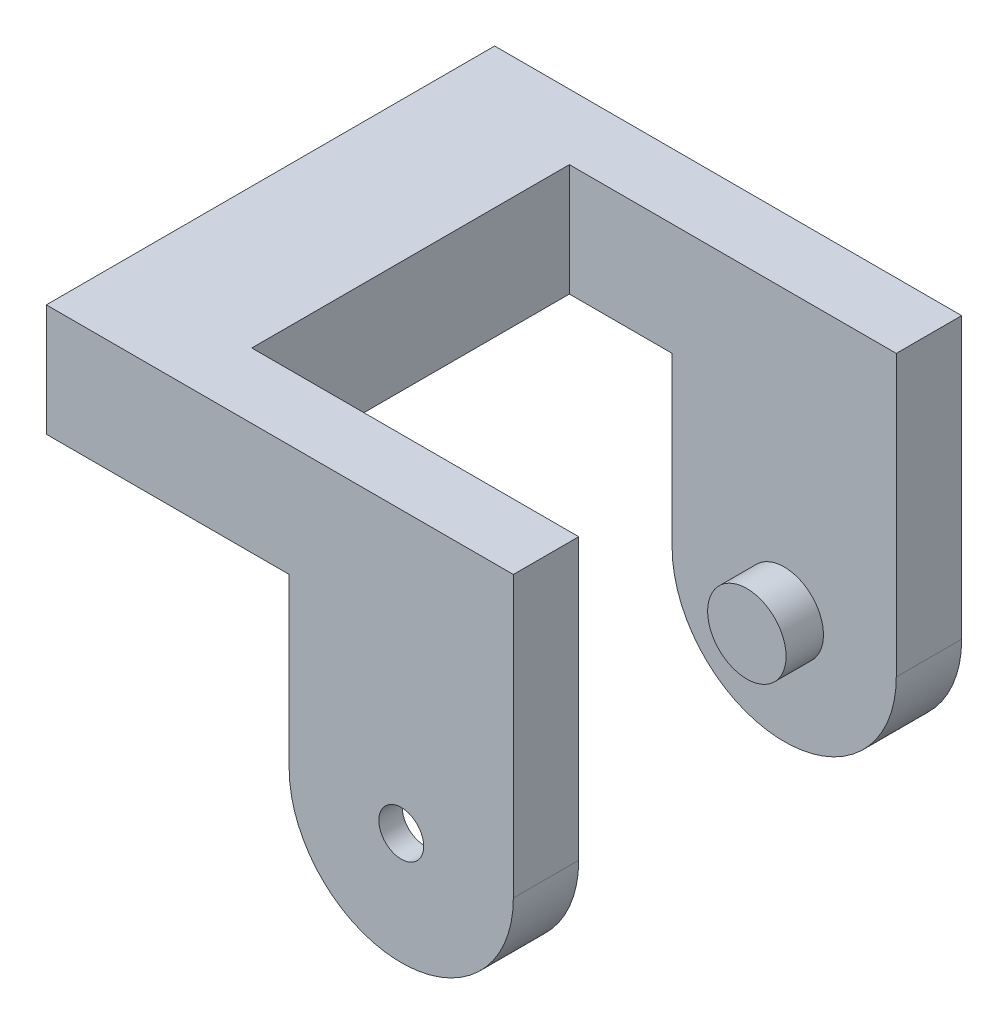
ISO-10303-21;
HEADER;
FILE_DESCRIPTION(('STEP AP214'),'2;1');
FILE_NAME('part.step','',(''),(''),'','','');
FILE_SCHEMA(('AUTOMOTIVE_DESIGN { 1 0 10303 214 1 1 1 1 }'));
ENDSEC;
DATA;
#1=APPLICATION_CONTEXT('core data for automotive mechanical design processes');
#2=APPLICATION_PROTOCOL_DEFINITION('international standard','automotive_design',2000,#1);
#3=PRODUCT_CONTEXT('',#1,'mechanical');
#4=PRODUCT('Part','Part','',(#3));
#5=PRODUCT_RELATED_PRODUCT_CATEGORY('part','',(#4));
#6=PRODUCT_DEFINITION_FORMATION('','',#4);
#7=PRODUCT_DEFINITION_CONTEXT('part definition',#1,'design');
#8=PRODUCT_DEFINITION('design','',#6,#7);
#9=PRODUCT_DEFINITION_SHAPE('','',#8);
#10=(LENGTH_UNIT() NAMED_UNIT(*) SI_UNIT(.MILLI.,.METRE.));
#11=(NAMED_UNIT(*) PLANE_ANGLE_UNIT() SI_UNIT($,.RADIAN.));
#12=(NAMED_UNIT(*) SI_UNIT($,.STERADIAN.) SOLID_ANGLE_UNIT());
#13=UNCERTAINTY_MEASURE_WITH_UNIT(LENGTH_MEASURE(1.E-05),#10,'distance_accuracy_value','');
#14=(GEOMETRIC_REPRESENTATION_CONTEXT(3) GLOBAL_UNCERTAINTY_ASSIGNED_CONTEXT((#13)) GLOBAL_UNIT_ASSIGNED_CONTEXT((#10,
#11,#12)) REPRESENTATION_CONTEXT('',''));
#15=CARTESIAN_POINT('',(0.,0.,0.));
#16=DIRECTION('',(0.,0.,1.));
#17=DIRECTION('',(1.,0.,0.));
#18=AXIS2_PLACEMENT_3D('',#15,#16,#17);
#19=CARTESIAN_POINT('',(12.,0.,-48.));
#20=DIRECTION('',(1.,0.,0.));
#21=DIRECTION('',(0.,0.,-1.));
#22=AXIS2_PLACEMENT_3D('',#19,#20,#21);
#23=PLANE('',#22);
#24=DIRECTION('',(0.,1.,0.));
#25=VECTOR('',#24,1.);
#26=CARTESIAN_POINT('',(12.,-12.,-7.));
#27=LINE('',#26,#25);
#28=CARTESIAN_POINT('',(12.,0.,-7.));
#29=VERTEX_POINT('',#28);
#30=CARTESIAN_POINT('',(12.,30.,-7.));
#31=VERTEX_POINT('',#30);
#32=EDGE_CURVE('E169',#29,#31,#27,.T.);
#33=ORIENTED_EDGE('',*,*,#32,.T.);
#34=DIRECTION('',(0.,0.,1.));
#35=VECTOR('',#34,1.);
#36=CARTESIAN_POINT('',(12.,30.,-48.));
#37=LINE('',#36,#35);
#38=CARTESIAN_POINT('',(12.,30.,0.));
#39=VERTEX_POINT('',#38);
#40=EDGE_CURVE('E251',#31,#39,#37,.T.);
#41=ORIENTED_EDGE('',*,*,#40,.T.);
#42=DIRECTION('',(0.,1.,0.));
#43=VECTOR('',#42,1.);
#44=CARTESIAN_POINT('',(12.,0.,0.));
#45=LINE('',#44,#43);
#46=CARTESIAN_POINT('',(12.,0.,0.));
#47=VERTEX_POINT('',#46);
#48=EDGE_CURVE('E196',#47,#39,#45,.T.);
#49=ORIENTED_EDGE('',*,*,#48,.F.);
#50=DIRECTION('',(0.,0.,1.));
#51=VECTOR('',#50,1.);
#52=CARTESIAN_POINT('',(12.,0.,-48.));
#53=LINE('',#52,#51);
#54=EDGE_CURVE('E160',#29,#47,#53,.T.);
#55=ORIENTED_EDGE('',*,*,#54,.F.);
#56=EDGE_LOOP('',(#33,#41,#49,#55));
#57=FACE_BOUND('',#56,.T.);
#58=ADVANCED_FACE('F47',(#57),#23,.T.);
#59=CARTESIAN_POINT('',(0.,0.,-48.));
#60=DIRECTION('',(0.,0.,1.));
#61=DIRECTION('',(1.,0.,0.));
#62=AXIS2_PLACEMENT_3D('',#59,#60,#61);
#63=CYLINDRICAL_SURFACE('',#62,2.4);
#64=CARTESIAN_POINT('',(0.,0.,0.));
#65=DIRECTION('',(0.,0.,1.));
#66=DIRECTION('',(1.,0.,0.));
#67=AXIS2_PLACEMENT_3D('',#64,#65,#66);
#68=CIRCLE('',#67,2.4);
#69=CARTESIAN_POINT('',(2.4,0.,0.));
#70=VERTEX_POINT('',#69);
#71=EDGE_CURVE('E174',#70,#70,#68,.T.);
#72=ORIENTED_EDGE('',*,*,#71,.T.);
#73=EDGE_LOOP('',(#72));
#74=FACE_BOUND('',#73,.T.);
#75=CARTESIAN_POINT('',(0.,0.,-2.5));
#76=DIRECTION('',(0.,0.,-1.));
#77=DIRECTION('',(0.,1.,0.));
#78=AXIS2_PLACEMENT_3D('',#75,#76,#77);
#79=CIRCLE('',#78,2.4);
#80=CARTESIAN_POINT('',(0.,2.4,-2.5));
#81=VERTEX_POINT('',#80);
#82=EDGE_CURVE('E206',#81,#81,#79,.F.);
#83=ORIENTED_EDGE('',*,*,#82,.F.);
#84=EDGE_LOOP('',(#83));
#85=FACE_BOUND('',#84,.T.);
#86=ADVANCED_FACE('F49',(#74,#85),#63,.F.);
#87=CARTESIAN_POINT('',(-12.,0.,-48.));
#88=DIRECTION('',(1.,0.,0.));
#89=DIRECTION('',(0.,0.,-1.));
#90=AXIS2_PLACEMENT_3D('',#87,#88,#89);
#91=PLANE('',#90);
#92=DIRECTION('',(0.,1.,0.));
#93=VECTOR('',#92,1.);
#94=CARTESIAN_POINT('',(-12.,0.,0.));
#95=LINE('',#94,#93);
#96=CARTESIAN_POINT('',(-12.,0.,0.));
#97=VERTEX_POINT('',#96);
#98=CARTESIAN_POINT('',(-12.,18.,0.));
#99=VERTEX_POINT('',#98);
#100=EDGE_CURVE('E171',#97,#99,#95,.T.);
#101=ORIENTED_EDGE('',*,*,#100,.T.);
#102=DIRECTION('',(0.,0.,-1.));
#103=VECTOR('',#102,1.);
#104=CARTESIAN_POINT('',(-12.,18.,0.));
#105=LINE('',#104,#103);
#106=CARTESIAN_POINT('',(-12.,18.,-6.99999999999999));
#107=VERTEX_POINT('',#106);
#108=EDGE_CURVE('E155',#99,#107,#105,.T.);
#109=ORIENTED_EDGE('',*,*,#108,.T.);
#110=DIRECTION('',(0.,1.,0.));
#111=VECTOR('',#110,1.);
#112=CARTESIAN_POINT('',(-12.,-12.,-7.));
#113=LINE('',#112,#111);
#114=CARTESIAN_POINT('',(-12.,0.,-7.));
#115=VERTEX_POINT('',#114);
#116=EDGE_CURVE('E141',#115,#107,#113,.T.);
#117=ORIENTED_EDGE('',*,*,#116,.F.);
#118=DIRECTION('',(0.,0.,1.));
#119=VECTOR('',#118,1.);
#120=CARTESIAN_POINT('',(-12.,0.,-48.));
#121=LINE('',#120,#119);
#122=EDGE_CURVE('E150',#115,#97,#121,.T.);
#123=ORIENTED_EDGE('',*,*,#122,.T.);
#124=EDGE_LOOP('',(#101,#109,#117,#123));
#125=FACE_BOUND('',#124,.T.);
#126=ADVANCED_FACE('F319',(#125),#91,.F.);
#127=CARTESIAN_POINT('',(0.,0.,-48.));
#128=DIRECTION('',(0.,0.,1.));
#129=DIRECTION('',(1.,0.,0.));
#130=AXIS2_PLACEMENT_3D('',#127,#128,#129);
#131=CYLINDRICAL_SURFACE('',#130,12.);
#132=CARTESIAN_POINT('',(0.,0.,-7.));
#133=DIRECTION('',(0.,0.,1.));
#134=DIRECTION('',(0.,-1.,0.));
#135=AXIS2_PLACEMENT_3D('',#132,#133,#134);
#136=CIRCLE('',#135,12.);
#137=EDGE_CURVE('E273',#29,#115,#136,.F.);
#138=ORIENTED_EDGE('',*,*,#137,.F.);
#139=ORIENTED_EDGE('',*,*,#54,.T.);
#140=CARTESIAN_POINT('',(0.,0.,0.));
#141=DIRECTION('',(0.,0.,1.));
#142=DIRECTION('',(1.,0.,0.));
#143=AXIS2_PLACEMENT_3D('',#140,#141,#142);
#144=CIRCLE('',#143,12.);
#145=EDGE_CURVE('E195',#97,#47,#144,.T.);
#146=ORIENTED_EDGE('',*,*,#145,.F.);
#147=ORIENTED_EDGE('',*,*,#122,.F.);
#148=EDGE_LOOP('',(#138,#139,#146,#147));
#149=FACE_BOUND('',#148,.T.);
#150=ADVANCED_FACE('F321',(#149),#131,.T.);
#151=CARTESIAN_POINT('',(12.,30.,-48.));
#152=VERTEX_POINT('',#151);
#153=CARTESIAN_POINT('',(12.,30.,-41.));
#154=VERTEX_POINT('',#153);
#155=EDGE_CURVE('E247',#152,#154,#37,.T.);
#156=ORIENTED_EDGE('',*,*,#155,.T.);
#157=DIRECTION('',(0.,-1.,0.));
#158=VECTOR('',#157,1.);
#159=CARTESIAN_POINT('',(12.,-12.,-41.));
#160=LINE('',#159,#158);
#161=CARTESIAN_POINT('',(12.,0.,-41.));
#162=VERTEX_POINT('',#161);
#163=EDGE_CURVE('E266',#154,#162,#160,.T.);
#164=ORIENTED_EDGE('',*,*,#163,.T.);
#165=CARTESIAN_POINT('',(12.,0.,-48.));
#166=VERTEX_POINT('',#165);
#167=EDGE_CURVE('E139',#166,#162,#53,.T.);
#168=ORIENTED_EDGE('',*,*,#167,.F.);
#169=DIRECTION('',(0.,1.,0.));
#170=VECTOR('',#169,1.);
#171=CARTESIAN_POINT('',(12.,0.,-48.));
#172=LINE('',#171,#170);
#173=EDGE_CURVE('E259',#166,#152,#172,.T.);
#174=ORIENTED_EDGE('',*,*,#173,.T.);
#175=EDGE_LOOP('',(#156,#164,#168,#174));
#176=FACE_BOUND('',#175,.T.);
#177=ADVANCED_FACE('F328',(#176),#23,.T.);
#178=CARTESIAN_POINT('',(0.,0.,-41.));
#179=DIRECTION('',(0.,0.,-1.));
#180=DIRECTION('',(-1.,0.,0.));
#181=AXIS2_PLACEMENT_3D('',#178,#179,#180);
#182=CIRCLE('',#181,12.);
#183=CARTESIAN_POINT('',(-12.,0.,-41.));
#184=VERTEX_POINT('',#183);
#185=EDGE_CURVE('E122',#184,#162,#182,.F.);
#186=ORIENTED_EDGE('',*,*,#185,.F.);
#187=CARTESIAN_POINT('',(-12.,0.,-48.));
#188=VERTEX_POINT('',#187);
#189=EDGE_CURVE('E136',#188,#184,#121,.T.);
#190=ORIENTED_EDGE('',*,*,#189,.F.);
#191=CARTESIAN_POINT('',(0.,0.,-48.));
#192=DIRECTION('',(0.,0.,1.));
#193=DIRECTION('',(1.,0.,0.));
#194=AXIS2_PLACEMENT_3D('',#191,#192,#193);
#195=CIRCLE('',#194,12.);
#196=EDGE_CURVE('E250',#188,#166,#195,.T.);
#197=ORIENTED_EDGE('',*,*,#196,.T.);
#198=ORIENTED_EDGE('',*,*,#167,.T.);
#199=EDGE_LOOP('',(#186,#190,#197,#198));
#200=FACE_BOUND('',#199,.T.);
#201=ADVANCED_FACE('F134',(#200),#131,.T.);
#202=DIRECTION('',(0.,-1.,0.));
#203=VECTOR('',#202,1.);
#204=CARTESIAN_POINT('',(-12.,-12.,-41.));
#205=LINE('',#204,#203);
#206=CARTESIAN_POINT('',(-12.,18.,-41.));
#207=VERTEX_POINT('',#206);
#208=EDGE_CURVE('E118',#207,#184,#205,.T.);
#209=ORIENTED_EDGE('',*,*,#208,.F.);
#210=CARTESIAN_POINT('',(-12.,18.,-48.));
#211=VERTEX_POINT('',#210);
#212=EDGE_CURVE('E148',#207,#211,#105,.T.);
#213=ORIENTED_EDGE('',*,*,#212,.T.);
#214=DIRECTION('',(0.,1.,0.));
#215=VECTOR('',#214,1.);
#216=CARTESIAN_POINT('',(-12.,0.,-48.));
#217=LINE('',#216,#215);
#218=EDGE_CURVE('E145',#188,#211,#217,.T.);
#219=ORIENTED_EDGE('',*,*,#218,.F.);
#220=ORIENTED_EDGE('',*,*,#189,.T.);
#221=EDGE_LOOP('',(#209,#213,#219,#220));
#222=FACE_BOUND('',#221,.T.);
#223=ADVANCED_FACE('F143',(#222),#91,.F.);
#224=CARTESIAN_POINT('',(0.,30.,-48.));
#225=DIRECTION('',(0.,-1.,0.));
#226=DIRECTION('',(0.,0.,-1.));
#227=AXIS2_PLACEMENT_3D('',#224,#225,#226);
#228=PLANE('',#227);
#229=ORIENTED_EDGE('',*,*,#40,.F.);
#230=DIRECTION('',(1.,0.,0.));
#231=VECTOR('',#230,1.);
#232=CARTESIAN_POINT('',(12.,30.,-7.));
#233=LINE('',#232,#231);
#234=CARTESIAN_POINT('',(-23.,30.,-6.99999999999999));
#235=VERTEX_POINT('',#234);
#236=EDGE_CURVE('E240',#235,#31,#233,.T.);
#237=ORIENTED_EDGE('',*,*,#236,.F.);
#238=DIRECTION('',(0.,0.,1.));
#239=VECTOR('',#238,1.);
#240=CARTESIAN_POINT('',(-23.,30.,-41.));
#241=LINE('',#240,#239);
#242=CARTESIAN_POINT('',(-23.,30.,-41.));
#243=VERTEX_POINT('',#242);
#244=EDGE_CURVE('E230',#243,#235,#241,.T.);
#245=ORIENTED_EDGE('',*,*,#244,.F.);
#246=DIRECTION('',(-1.,0.,0.));
#247=VECTOR('',#246,1.);
#248=CARTESIAN_POINT('',(12.,30.,-41.));
#249=LINE('',#248,#247);
#250=EDGE_CURVE('E307',#154,#243,#249,.T.);
#251=ORIENTED_EDGE('',*,*,#250,.F.);
#252=ORIENTED_EDGE('',*,*,#155,.F.);
#253=DIRECTION('',(1.,0.,0.));
#254=VECTOR('',#253,1.);
#255=CARTESIAN_POINT('',(0.,30.,-48.));
#256=LINE('',#255,#254);
#257=CARTESIAN_POINT('',(-38.,30.,-48.));
#258=VERTEX_POINT('',#257);
#259=EDGE_CURVE('E101',#258,#152,#256,.T.);
#260=ORIENTED_EDGE('',*,*,#259,.F.);
#261=DIRECTION('',(0.,0.,-1.));
#262=VECTOR('',#261,1.);
#263=CARTESIAN_POINT('',(-38.,30.,0.));
#264=LINE('',#263,#262);
#265=CARTESIAN_POINT('',(-38.,30.,0.));
#266=VERTEX_POINT('',#265);
#267=EDGE_CURVE('E178',#266,#258,#264,.T.);
#268=ORIENTED_EDGE('',*,*,#267,.F.);
#269=DIRECTION('',(1.,0.,0.));
#270=VECTOR('',#269,1.);
#271=CARTESIAN_POINT('',(0.,30.,0.));
#272=LINE('',#271,#270);
#273=EDGE_CURVE('E94',#266,#39,#272,.T.);
#274=ORIENTED_EDGE('',*,*,#273,.T.);
#275=EDGE_LOOP('',(#229,#237,#245,#251,#252,#260,#268,#274));
#276=FACE_BOUND('',#275,.T.);
#277=ADVANCED_FACE('F286',(#276),#228,.F.);
#278=CARTESIAN_POINT('',(0.,0.,-48.));
#279=DIRECTION('',(0.,0.,1.));
#280=DIRECTION('',(1.,0.,0.));
#281=AXIS2_PLACEMENT_3D('',#278,#279,#280);
#282=PLANE('',#281);
#283=ORIENTED_EDGE('',*,*,#173,.F.);
#284=ORIENTED_EDGE('',*,*,#196,.F.);
#285=ORIENTED_EDGE('',*,*,#218,.T.);
#286=DIRECTION('',(-1.,0.,0.));
#287=VECTOR('',#286,1.);
#288=CARTESIAN_POINT('',(0.,18.,-48.));
#289=LINE('',#288,#287);
#290=CARTESIAN_POINT('',(-38.,18.,-48.));
#291=VERTEX_POINT('',#290);
#292=EDGE_CURVE('E72',#211,#291,#289,.T.);
#293=ORIENTED_EDGE('',*,*,#292,.T.);
#294=DIRECTION('',(0.,-1.,0.));
#295=VECTOR('',#294,1.);
#296=CARTESIAN_POINT('',(-38.,0.,-48.));
#297=LINE('',#296,#295);
#298=EDGE_CURVE('E183',#258,#291,#297,.T.);
#299=ORIENTED_EDGE('',*,*,#298,.F.);
#300=ORIENTED_EDGE('',*,*,#259,.T.);
#301=EDGE_LOOP('',(#283,#284,#285,#293,#299,#300));
#302=FACE_BOUND('',#301,.T.);
#303=ADVANCED_FACE('F298',(#302),#282,.F.);
#304=CARTESIAN_POINT('',(0.,0.,0.));
#305=DIRECTION('',(0.,0.,1.));
#306=DIRECTION('',(1.,0.,0.));
#307=AXIS2_PLACEMENT_3D('',#304,#305,#306);
#308=PLANE('',#307);
#309=ORIENTED_EDGE('',*,*,#71,.F.);
#310=EDGE_LOOP('',(#309));
#311=FACE_BOUND('',#310,.T.);
#312=ORIENTED_EDGE('',*,*,#48,.T.);
#313=ORIENTED_EDGE('',*,*,#273,.F.);
#314=DIRECTION('',(0.,-1.,0.));
#315=VECTOR('',#314,1.);
#316=CARTESIAN_POINT('',(-38.,0.,0.));
#317=LINE('',#316,#315);
#318=CARTESIAN_POINT('',(-38.,18.,0.));
#319=VERTEX_POINT('',#318);
#320=EDGE_CURVE('E192',#266,#319,#317,.T.);
#321=ORIENTED_EDGE('',*,*,#320,.T.);
#322=DIRECTION('',(-1.,0.,0.));
#323=VECTOR('',#322,1.);
#324=CARTESIAN_POINT('',(0.,18.,0.));
#325=LINE('',#324,#323);
#326=EDGE_CURVE('E130',#99,#319,#325,.T.);
#327=ORIENTED_EDGE('',*,*,#326,.F.);
#328=ORIENTED_EDGE('',*,*,#100,.F.);
#329=ORIENTED_EDGE('',*,*,#145,.T.);
#330=EDGE_LOOP('',(#312,#313,#321,#327,#328,#329));
#331=FACE_BOUND('',#330,.T.);
#332=ADVANCED_FACE('F292',(#311,#331),#308,.T.);
#333=CARTESIAN_POINT('',(12.,-12.,-7.));
#334=DIRECTION('',(0.,0.,1.));
#335=DIRECTION('',(0.,-1.,0.));
#336=AXIS2_PLACEMENT_3D('',#333,#334,#335);
#337=PLANE('',#336);
#338=CARTESIAN_POINT('',(0.,0.,-7.));
#339=DIRECTION('',(0.,0.,-1.));
#340=DIRECTION('',(0.,1.,0.));
#341=AXIS2_PLACEMENT_3D('',#338,#339,#340);
#342=CIRCLE('',#341,9.5);
#343=CARTESIAN_POINT('',(0.,9.5,-7.));
#344=VERTEX_POINT('',#343);
#345=EDGE_CURVE('E201',#344,#344,#342,.T.);
#346=ORIENTED_EDGE('',*,*,#345,.F.);
#347=EDGE_LOOP('',(#346));
#348=FACE_BOUND('',#347,.T.);
#349=ORIENTED_EDGE('',*,*,#116,.T.);
#350=DIRECTION('',(1.,0.,0.));
#351=VECTOR('',#350,1.);
#352=CARTESIAN_POINT('',(12.,18.,-7.));
#353=LINE('',#352,#351);
#354=CARTESIAN_POINT('',(-23.,18.,-6.99999999999999));
#355=VERTEX_POINT('',#354);
#356=EDGE_CURVE('E11',#355,#107,#353,.T.);
#357=ORIENTED_EDGE('',*,*,#356,.F.);
#358=DIRECTION('',(0.,1.,0.));
#359=VECTOR('',#358,1.);
#360=CARTESIAN_POINT('',(-23.,15.5,-6.99999999999999));
#361=LINE('',#360,#359);
#362=EDGE_CURVE('E227',#355,#235,#361,.T.);
#363=ORIENTED_EDGE('',*,*,#362,.T.);
#364=ORIENTED_EDGE('',*,*,#236,.T.);
#365=ORIENTED_EDGE('',*,*,#32,.F.);
#366=ORIENTED_EDGE('',*,*,#137,.T.);
#367=EDGE_LOOP('',(#349,#357,#363,#364,#365,#366));
#368=FACE_BOUND('',#367,.T.);
#369=ADVANCED_FACE('F283',(#348,#368),#337,.F.);
#370=CARTESIAN_POINT('',(12.,-12.,-41.));
#371=DIRECTION('',(0.,0.,-1.));
#372=DIRECTION('',(-1.,0.,0.));
#373=AXIS2_PLACEMENT_3D('',#370,#371,#372);
#374=PLANE('',#373);
#375=CARTESIAN_POINT('',(0.,0.,-41.));
#376=DIRECTION('',(0.,0.,-1.));
#377=DIRECTION('',(-1.,0.,0.));
#378=AXIS2_PLACEMENT_3D('',#375,#376,#377);
#379=CIRCLE('',#378,4.2);
#380=CARTESIAN_POINT('',(-4.2,0.,-41.));
#381=VERTEX_POINT('',#380);
#382=EDGE_CURVE('E205',#381,#381,#379,.F.);
#383=ORIENTED_EDGE('',*,*,#382,.F.);
#384=EDGE_LOOP('',(#383));
#385=FACE_BOUND('',#384,.T.);
#386=ORIENTED_EDGE('',*,*,#185,.T.);
#387=ORIENTED_EDGE('',*,*,#163,.F.);
#388=ORIENTED_EDGE('',*,*,#250,.T.);
#389=DIRECTION('',(0.,1.,0.));
#390=VECTOR('',#389,1.);
#391=CARTESIAN_POINT('',(-23.,15.5,-41.));
#392=LINE('',#391,#390);
#393=CARTESIAN_POINT('',(-23.,18.,-41.));
#394=VERTEX_POINT('',#393);
#395=EDGE_CURVE('E63',#394,#243,#392,.T.);
#396=ORIENTED_EDGE('',*,*,#395,.F.);
#397=DIRECTION('',(-1.,0.,0.));
#398=VECTOR('',#397,1.);
#399=CARTESIAN_POINT('',(12.,18.,-41.));
#400=LINE('',#399,#398);
#401=EDGE_CURVE('E126',#207,#394,#400,.T.);
#402=ORIENTED_EDGE('',*,*,#401,.F.);
#403=ORIENTED_EDGE('',*,*,#208,.T.);
#404=EDGE_LOOP('',(#386,#387,#388,#396,#402,#403));
#405=FACE_BOUND('',#404,.T.);
#406=ADVANCED_FACE('F120',(#385,#405),#374,.F.);
#407=CARTESIAN_POINT('',(12.,18.,-7.));
#408=DIRECTION('',(0.,1.,0.));
#409=DIRECTION('',(0.,0.,1.));
#410=AXIS2_PLACEMENT_3D('',#407,#408,#409);
#411=PLANE('',#410);
#412=DIRECTION('',(0.,0.,1.));
#413=VECTOR('',#412,1.);
#414=CARTESIAN_POINT('',(-23.,18.,-6.99999999999999));
#415=LINE('',#414,#413);
#416=EDGE_CURVE('E56',#394,#355,#415,.T.);
#417=ORIENTED_EDGE('',*,*,#416,.T.);
#418=ORIENTED_EDGE('',*,*,#356,.T.);
#419=ORIENTED_EDGE('',*,*,#108,.F.);
#420=ORIENTED_EDGE('',*,*,#326,.T.);
#421=DIRECTION('',(0.,0.,-1.));
#422=VECTOR('',#421,1.);
#423=CARTESIAN_POINT('',(-38.,18.,0.));
#424=LINE('',#423,#422);
#425=EDGE_CURVE('E180',#319,#291,#424,.T.);
#426=ORIENTED_EDGE('',*,*,#425,.T.);
#427=ORIENTED_EDGE('',*,*,#292,.F.);
#428=ORIENTED_EDGE('',*,*,#212,.F.);
#429=ORIENTED_EDGE('',*,*,#401,.T.);
#430=EDGE_LOOP('',(#417,#418,#419,#420,#426,#427,#428,#429));
#431=FACE_BOUND('',#430,.T.);
#432=ADVANCED_FACE('F218',(#431),#411,.F.);
#433=CARTESIAN_POINT('',(-38.,0.,0.));
#434=DIRECTION('',(1.,0.,0.));
#435=DIRECTION('',(0.,0.,-1.));
#436=AXIS2_PLACEMENT_3D('',#433,#434,#435);
#437=PLANE('',#436);
#438=ORIENTED_EDGE('',*,*,#298,.T.);
#439=ORIENTED_EDGE('',*,*,#425,.F.);
#440=ORIENTED_EDGE('',*,*,#320,.F.);
#441=ORIENTED_EDGE('',*,*,#267,.T.);
#442=EDGE_LOOP('',(#438,#439,#440,#441));
#443=FACE_BOUND('',#442,.T.);
#444=ADVANCED_FACE('F312',(#443),#437,.F.);
#445=CARTESIAN_POINT('',(0.,0.,-2.5));
#446=DIRECTION('',(0.,0.,-1.));
#447=DIRECTION('',(0.,1.,0.));
#448=AXIS2_PLACEMENT_3D('',#445,#446,#447);
#449=PLANE('',#448);
#450=CARTESIAN_POINT('',(0.,0.,-2.5));
#451=DIRECTION('',(0.,0.,-1.));
#452=DIRECTION('',(0.,1.,0.));
#453=AXIS2_PLACEMENT_3D('',#450,#451,#452);
#454=CIRCLE('',#453,9.5);
#455=CARTESIAN_POINT('',(0.,9.5,-2.5));
#456=VERTEX_POINT('',#455);
#457=EDGE_CURVE('E207',#456,#456,#454,.T.);
#458=ORIENTED_EDGE('',*,*,#457,.T.);
#459=EDGE_LOOP('',(#458));
#460=FACE_BOUND('',#459,.T.);
#461=ORIENTED_EDGE('',*,*,#82,.T.);
#462=EDGE_LOOP('',(#461));
#463=FACE_BOUND('',#462,.T.);
#464=ADVANCED_FACE('F360',(#460,#463),#449,.T.);
#465=CARTESIAN_POINT('',(0.,0.,-2.5));
#466=DIRECTION('',(0.,0.,-1.));
#467=DIRECTION('',(0.,1.,0.));
#468=AXIS2_PLACEMENT_3D('',#465,#466,#467);
#469=CYLINDRICAL_SURFACE('',#468,9.5);
#470=ORIENTED_EDGE('',*,*,#457,.F.);
#471=EDGE_LOOP('',(#470));
#472=FACE_BOUND('',#471,.T.);
#473=ORIENTED_EDGE('',*,*,#345,.T.);
#474=EDGE_LOOP('',(#473));
#475=FACE_BOUND('',#474,.T.);
#476=ADVANCED_FACE('F361',(#472,#475),#469,.F.);
#477=CARTESIAN_POINT('',(0.,0.,-37.));
#478=DIRECTION('',(0.,0.,-1.));
#479=DIRECTION('',(-1.,0.,0.));
#480=AXIS2_PLACEMENT_3D('',#477,#478,#479);
#481=CYLINDRICAL_SURFACE('',#480,4.2);
#482=CARTESIAN_POINT('',(0.,0.,-37.));
#483=DIRECTION('',(0.,0.,1.));
#484=DIRECTION('',(1.,0.,0.));
#485=AXIS2_PLACEMENT_3D('',#482,#483,#484);
#486=CIRCLE('',#485,4.2);
#487=CARTESIAN_POINT('',(4.2,0.,-37.));
#488=VERTEX_POINT('',#487);
#489=EDGE_CURVE('E200',#488,#488,#486,.T.);
#490=ORIENTED_EDGE('',*,*,#489,.F.);
#491=EDGE_LOOP('',(#490));
#492=FACE_BOUND('',#491,.T.);
#493=ORIENTED_EDGE('',*,*,#382,.T.);
#494=EDGE_LOOP('',(#493));
#495=FACE_BOUND('',#494,.T.);
#496=ADVANCED_FACE('F363',(#492,#495),#481,.T.);
#497=CARTESIAN_POINT('',(0.,0.,-37.));
#498=DIRECTION('',(0.,0.,1.));
#499=DIRECTION('',(1.,0.,0.));
#500=AXIS2_PLACEMENT_3D('',#497,#498,#499);
#501=PLANE('',#500);
#502=ORIENTED_EDGE('',*,*,#489,.T.);
#503=EDGE_LOOP('',(#502));
#504=FACE_BOUND('',#503,.T.);
#505=ADVANCED_FACE('F390',(#504),#501,.T.);
#506=CARTESIAN_POINT('',(-23.,15.5,-41.));
#507=DIRECTION('',(-1.,0.,0.));
#508=DIRECTION('',(0.,0.,1.));
#509=AXIS2_PLACEMENT_3D('',#506,#507,#508);
#510=PLANE('',#509);
#511=ORIENTED_EDGE('',*,*,#395,.T.);
#512=ORIENTED_EDGE('',*,*,#244,.T.);
#513=ORIENTED_EDGE('',*,*,#362,.F.);
#514=ORIENTED_EDGE('',*,*,#416,.F.);
#515=EDGE_LOOP('',(#511,#512,#513,#514));
#516=FACE_BOUND('',#515,.T.);
#517=ADVANCED_FACE('F223',(#516),#510,.F.);
#518=CLOSED_SHELL('',(#58,#86,#126,#150,#177,#201,#223,#277,#303,#332,#369,#406,#432,#444,#464,
#476,#496,#505,#517));
#519=MANIFOLD_SOLID_BREP('B2',#518);
#520=ADVANCED_BREP_SHAPE_REPRESENTATION('',(#18,#519),#14);
#521=SHAPE_DEFINITION_REPRESENTATION(#9,#520);
ENDSEC;
END-ISO-10303-21;
